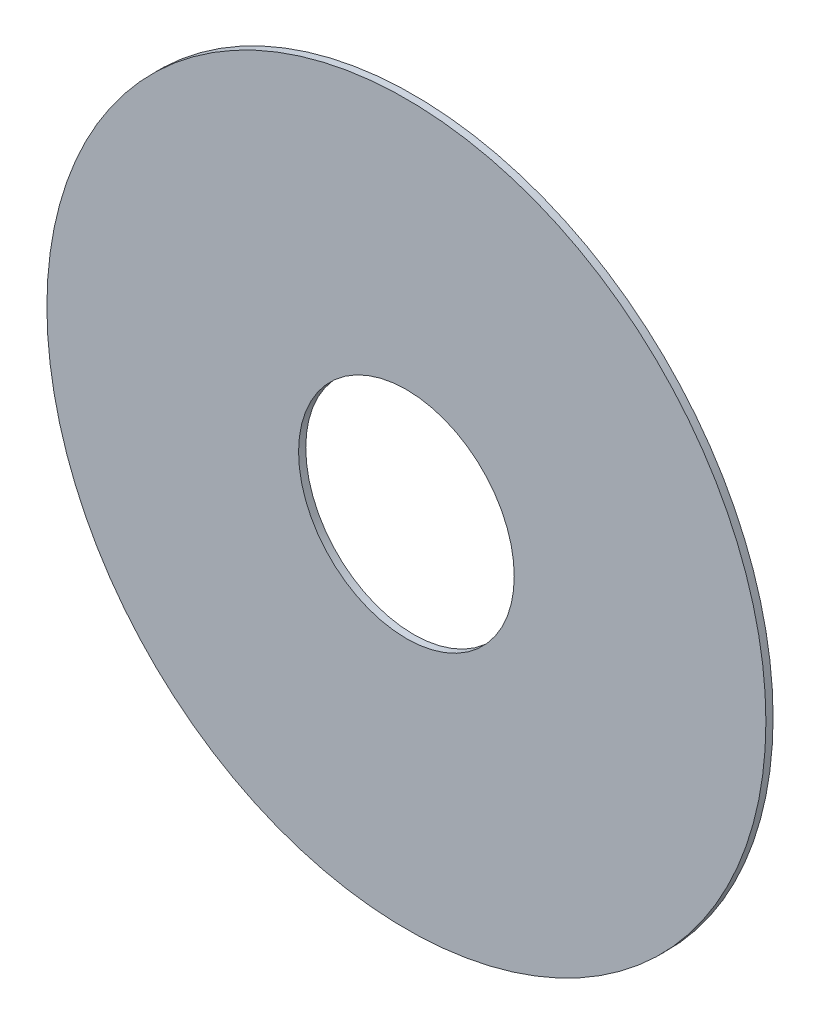
ISO-10303-21;
HEADER;
FILE_DESCRIPTION(('STEP AP214'),'2;1');
FILE_NAME('part.step','',(''),(''),'','','');
FILE_SCHEMA(('AUTOMOTIVE_DESIGN { 1 0 10303 214 1 1 1 1 }'));
ENDSEC;
DATA;
#1=APPLICATION_CONTEXT('core data for automotive mechanical design processes');
#2=APPLICATION_PROTOCOL_DEFINITION('international standard','automotive_design',2000,#1);
#3=PRODUCT_CONTEXT('',#1,'mechanical');
#4=PRODUCT('Part','Part','',(#3));
#5=PRODUCT_RELATED_PRODUCT_CATEGORY('part','',(#4));
#6=PRODUCT_DEFINITION_FORMATION('','',#4);
#7=PRODUCT_DEFINITION_CONTEXT('part definition',#1,'design');
#8=PRODUCT_DEFINITION('design','',#6,#7);
#9=PRODUCT_DEFINITION_SHAPE('','',#8);
#10=(LENGTH_UNIT() NAMED_UNIT(*) SI_UNIT(.MILLI.,.METRE.));
#11=(NAMED_UNIT(*) PLANE_ANGLE_UNIT() SI_UNIT($,.RADIAN.));
#12=(NAMED_UNIT(*) SI_UNIT($,.STERADIAN.) SOLID_ANGLE_UNIT());
#13=UNCERTAINTY_MEASURE_WITH_UNIT(LENGTH_MEASURE(1.E-05),#10,'distance_accuracy_value','');
#14=(GEOMETRIC_REPRESENTATION_CONTEXT(3) GLOBAL_UNCERTAINTY_ASSIGNED_CONTEXT((#13)) GLOBAL_UNIT_ASSIGNED_CONTEXT((#10,
#11,#12)) REPRESENTATION_CONTEXT('',''));
#15=CARTESIAN_POINT('',(0.,0.,0.));
#16=DIRECTION('',(0.,0.,1.));
#17=DIRECTION('',(1.,0.,0.));
#18=AXIS2_PLACEMENT_3D('',#15,#16,#17);
#19=CARTESIAN_POINT('',(0.,0.,-2.));
#20=DIRECTION('',(0.,0.,1.));
#21=DIRECTION('',(1.,0.,0.));
#22=AXIS2_PLACEMENT_3D('',#19,#20,#21);
#23=CYLINDRICAL_SURFACE('',#22,100.);
#24=CARTESIAN_POINT('',(0.,0.,-2.));
#25=DIRECTION('',(0.,0.,1.));
#26=DIRECTION('',(1.,0.,0.));
#27=AXIS2_PLACEMENT_3D('',#24,#25,#26);
#28=CIRCLE('',#27,100.);
#29=CARTESIAN_POINT('',(100.,0.,-2.));
#30=VERTEX_POINT('',#29);
#31=EDGE_CURVE('E10',#30,#30,#28,.T.);
#32=ORIENTED_EDGE('',*,*,#31,.T.);
#33=EDGE_LOOP('',(#32));
#34=FACE_BOUND('',#33,.T.);
#35=CARTESIAN_POINT('',(0.,0.,0.));
#36=DIRECTION('',(0.,0.,1.));
#37=DIRECTION('',(1.,0.,0.));
#38=AXIS2_PLACEMENT_3D('',#35,#36,#37);
#39=CIRCLE('',#38,100.);
#40=CARTESIAN_POINT('',(100.,0.,0.));
#41=VERTEX_POINT('',#40);
#42=EDGE_CURVE('E46',#41,#41,#39,.T.);
#43=ORIENTED_EDGE('',*,*,#42,.F.);
#44=EDGE_LOOP('',(#43));
#45=FACE_BOUND('',#44,.T.);
#46=ADVANCED_FACE('F43',(#34,#45),#23,.T.);
#47=CARTESIAN_POINT('',(0.,0.,-2.));
#48=DIRECTION('',(0.,0.,1.));
#49=DIRECTION('',(1.,0.,0.));
#50=AXIS2_PLACEMENT_3D('',#47,#48,#49);
#51=PLANE('',#50);
#52=CARTESIAN_POINT('',(0.,0.,-2.));
#53=DIRECTION('',(0.,0.,1.));
#54=DIRECTION('',(1.,0.,0.));
#55=AXIS2_PLACEMENT_3D('',#52,#53,#54);
#56=CIRCLE('',#55,30.);
#57=CARTESIAN_POINT('',(30.,0.,-2.));
#58=VERTEX_POINT('',#57);
#59=EDGE_CURVE('E55',#58,#58,#56,.T.);
#60=ORIENTED_EDGE('',*,*,#59,.T.);
#61=EDGE_LOOP('',(#60));
#62=FACE_BOUND('',#61,.T.);
#63=ORIENTED_EDGE('',*,*,#31,.F.);
#64=EDGE_LOOP('',(#63));
#65=FACE_BOUND('',#64,.T.);
#66=ADVANCED_FACE('F65',(#62,#65),#51,.F.);
#67=CARTESIAN_POINT('',(0.,0.,0.));
#68=DIRECTION('',(0.,0.,1.));
#69=DIRECTION('',(1.,0.,0.));
#70=AXIS2_PLACEMENT_3D('',#67,#68,#69);
#71=PLANE('',#70);
#72=CARTESIAN_POINT('',(0.,0.,0.));
#73=DIRECTION('',(0.,0.,1.));
#74=DIRECTION('',(1.,0.,0.));
#75=AXIS2_PLACEMENT_3D('',#72,#73,#74);
#76=CIRCLE('',#75,30.);
#77=CARTESIAN_POINT('',(30.,0.,0.));
#78=VERTEX_POINT('',#77);
#79=EDGE_CURVE('E57',#78,#78,#76,.T.);
#80=ORIENTED_EDGE('',*,*,#79,.F.);
#81=EDGE_LOOP('',(#80));
#82=FACE_BOUND('',#81,.T.);
#83=ORIENTED_EDGE('',*,*,#42,.T.);
#84=EDGE_LOOP('',(#83));
#85=FACE_BOUND('',#84,.T.);
#86=ADVANCED_FACE('F71',(#82,#85),#71,.T.);
#87=CARTESIAN_POINT('',(0.,0.,-2.));
#88=DIRECTION('',(0.,0.,1.));
#89=DIRECTION('',(1.,0.,0.));
#90=AXIS2_PLACEMENT_3D('',#87,#88,#89);
#91=CYLINDRICAL_SURFACE('',#90,30.);
#92=ORIENTED_EDGE('',*,*,#59,.F.);
#93=EDGE_LOOP('',(#92));
#94=FACE_BOUND('',#93,.T.);
#95=ORIENTED_EDGE('',*,*,#79,.T.);
#96=EDGE_LOOP('',(#95));
#97=FACE_BOUND('',#96,.T.);
#98=ADVANCED_FACE('F68',(#94,#97),#91,.F.);
#99=CLOSED_SHELL('',(#46,#66,#86,#98));
#100=MANIFOLD_SOLID_BREP('B2',#99);
#101=ADVANCED_BREP_SHAPE_REPRESENTATION('',(#18,#100),#14);
#102=SHAPE_DEFINITION_REPRESENTATION(#9,#101);
ENDSEC;
END-ISO-10303-21;
